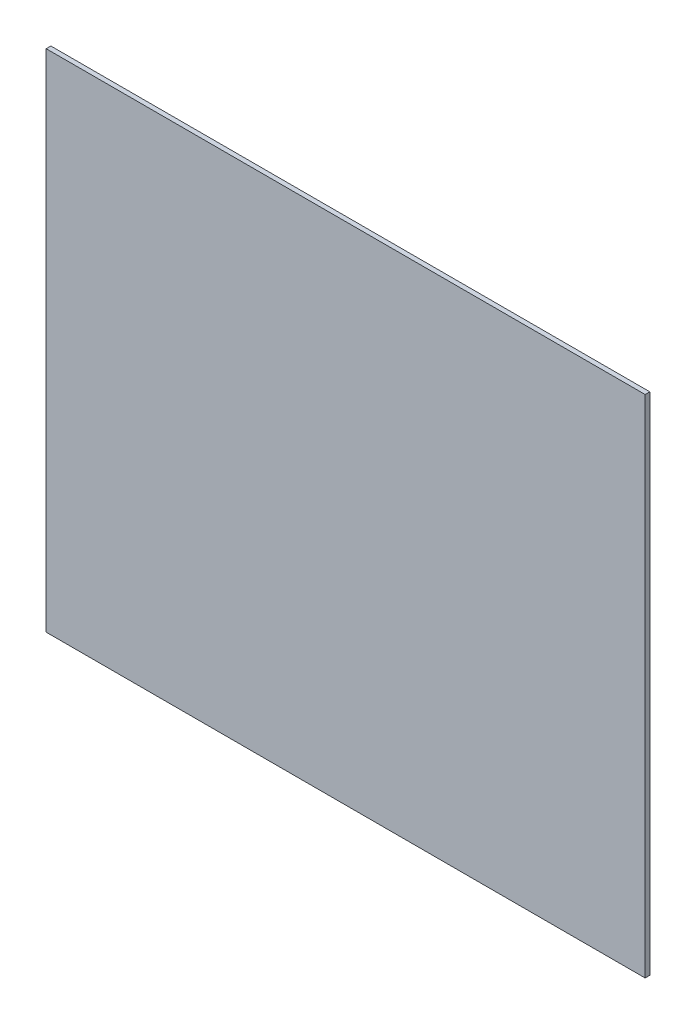
ISO-10303-21;
HEADER;
FILE_DESCRIPTION(('STEP AP214'),'2;1');
FILE_NAME('part.step','',(''),(''),'','','');
FILE_SCHEMA(('AUTOMOTIVE_DESIGN { 1 0 10303 214 1 1 1 1 }'));
ENDSEC;
DATA;
#1=APPLICATION_CONTEXT('core data for automotive mechanical design processes');
#2=APPLICATION_PROTOCOL_DEFINITION('international standard','automotive_design',2000,#1);
#3=PRODUCT_CONTEXT('',#1,'mechanical');
#4=PRODUCT('Part','Part','',(#3));
#5=PRODUCT_RELATED_PRODUCT_CATEGORY('part','',(#4));
#6=PRODUCT_DEFINITION_FORMATION('','',#4);
#7=PRODUCT_DEFINITION_CONTEXT('part definition',#1,'design');
#8=PRODUCT_DEFINITION('design','',#6,#7);
#9=PRODUCT_DEFINITION_SHAPE('','',#8);
#10=(LENGTH_UNIT() NAMED_UNIT(*) SI_UNIT(.MILLI.,.METRE.));
#11=(NAMED_UNIT(*) PLANE_ANGLE_UNIT() SI_UNIT($,.RADIAN.));
#12=(NAMED_UNIT(*) SI_UNIT($,.STERADIAN.) SOLID_ANGLE_UNIT());
#13=UNCERTAINTY_MEASURE_WITH_UNIT(LENGTH_MEASURE(1.E-05),#10,'distance_accuracy_value','');
#14=(GEOMETRIC_REPRESENTATION_CONTEXT(3) GLOBAL_UNCERTAINTY_ASSIGNED_CONTEXT((#13)) GLOBAL_UNIT_ASSIGNED_CONTEXT((#10,
#11,#12)) REPRESENTATION_CONTEXT('',''));
#15=CARTESIAN_POINT('',(0.,0.,0.));
#16=DIRECTION('',(0.,0.,1.));
#17=DIRECTION('',(1.,0.,0.));
#18=AXIS2_PLACEMENT_3D('',#15,#16,#17);
#19=CARTESIAN_POINT('',(416.,-351.,6.5));
#20=DIRECTION('',(-1.,0.,0.));
#21=DIRECTION('',(0.,0.,1.));
#22=AXIS2_PLACEMENT_3D('',#19,#20,#21);
#23=PLANE('',#22);
#24=DIRECTION('',(0.,1.,0.));
#25=VECTOR('',#24,1.);
#26=CARTESIAN_POINT('',(416.,-351.,0.));
#27=LINE('',#26,#25);
#28=CARTESIAN_POINT('',(416.,-351.,0.));
#29=VERTEX_POINT('',#28);
#30=CARTESIAN_POINT('',(416.,351.,0.));
#31=VERTEX_POINT('',#30);
#32=EDGE_CURVE('E95',#29,#31,#27,.T.);
#33=ORIENTED_EDGE('',*,*,#32,.T.);
#34=DIRECTION('',(0.,0.,-1.));
#35=VECTOR('',#34,1.);
#36=CARTESIAN_POINT('',(416.,351.,6.5));
#37=LINE('',#36,#35);
#38=CARTESIAN_POINT('',(416.,351.,6.5));
#39=VERTEX_POINT('',#38);
#40=EDGE_CURVE('E11',#39,#31,#37,.T.);
#41=ORIENTED_EDGE('',*,*,#40,.F.);
#42=DIRECTION('',(0.,1.,0.));
#43=VECTOR('',#42,1.);
#44=CARTESIAN_POINT('',(416.,-351.,6.5));
#45=LINE('',#44,#43);
#46=CARTESIAN_POINT('',(416.,-351.,6.5));
#47=VERTEX_POINT('',#46);
#48=EDGE_CURVE('E83',#47,#39,#45,.T.);
#49=ORIENTED_EDGE('',*,*,#48,.F.);
#50=DIRECTION('',(0.,0.,-1.));
#51=VECTOR('',#50,1.);
#52=CARTESIAN_POINT('',(416.,-351.,6.5));
#53=LINE('',#52,#51);
#54=EDGE_CURVE('E91',#47,#29,#53,.T.);
#55=ORIENTED_EDGE('',*,*,#54,.T.);
#56=EDGE_LOOP('',(#33,#41,#49,#55));
#57=FACE_BOUND('',#56,.T.);
#58=ADVANCED_FACE('F32',(#57),#23,.F.);
#59=CARTESIAN_POINT('',(-416.,351.,6.5));
#60=DIRECTION('',(0.,-1.,0.));
#61=DIRECTION('',(0.,0.,-1.));
#62=AXIS2_PLACEMENT_3D('',#59,#60,#61);
#63=PLANE('',#62);
#64=DIRECTION('',(-1.,0.,0.));
#65=VECTOR('',#64,1.);
#66=CARTESIAN_POINT('',(-416.,351.,0.));
#67=LINE('',#66,#65);
#68=CARTESIAN_POINT('',(-416.,351.,0.));
#69=VERTEX_POINT('',#68);
#70=EDGE_CURVE('E87',#31,#69,#67,.T.);
#71=ORIENTED_EDGE('',*,*,#70,.T.);
#72=DIRECTION('',(0.,0.,-1.));
#73=VECTOR('',#72,1.);
#74=CARTESIAN_POINT('',(-416.,351.,6.5));
#75=LINE('',#74,#73);
#76=CARTESIAN_POINT('',(-416.,351.,6.5));
#77=VERTEX_POINT('',#76);
#78=EDGE_CURVE('E40',#77,#69,#75,.T.);
#79=ORIENTED_EDGE('',*,*,#78,.F.);
#80=DIRECTION('',(-1.,0.,0.));
#81=VECTOR('',#80,1.);
#82=CARTESIAN_POINT('',(-416.,351.,6.5));
#83=LINE('',#82,#81);
#84=EDGE_CURVE('E78',#39,#77,#83,.T.);
#85=ORIENTED_EDGE('',*,*,#84,.F.);
#86=ORIENTED_EDGE('',*,*,#40,.T.);
#87=EDGE_LOOP('',(#71,#79,#85,#86));
#88=FACE_BOUND('',#87,.T.);
#89=ADVANCED_FACE('F86',(#88),#63,.F.);
#90=CARTESIAN_POINT('',(-416.,-351.,6.5));
#91=DIRECTION('',(1.,0.,0.));
#92=DIRECTION('',(0.,0.,-1.));
#93=AXIS2_PLACEMENT_3D('',#90,#91,#92);
#94=PLANE('',#93);
#95=DIRECTION('',(0.,-1.,0.));
#96=VECTOR('',#95,1.);
#97=CARTESIAN_POINT('',(-416.,-351.,0.));
#98=LINE('',#97,#96);
#99=CARTESIAN_POINT('',(-416.,-351.,0.));
#100=VERTEX_POINT('',#99);
#101=EDGE_CURVE('E65',#69,#100,#98,.T.);
#102=ORIENTED_EDGE('',*,*,#101,.T.);
#103=DIRECTION('',(0.,0.,-1.));
#104=VECTOR('',#103,1.);
#105=CARTESIAN_POINT('',(-416.,-351.,6.5));
#106=LINE('',#105,#104);
#107=CARTESIAN_POINT('',(-416.,-351.,6.5));
#108=VERTEX_POINT('',#107);
#109=EDGE_CURVE('E88',#108,#100,#106,.T.);
#110=ORIENTED_EDGE('',*,*,#109,.F.);
#111=DIRECTION('',(0.,-1.,0.));
#112=VECTOR('',#111,1.);
#113=CARTESIAN_POINT('',(-416.,-351.,6.5));
#114=LINE('',#113,#112);
#115=EDGE_CURVE('E81',#77,#108,#114,.T.);
#116=ORIENTED_EDGE('',*,*,#115,.F.);
#117=ORIENTED_EDGE('',*,*,#78,.T.);
#118=EDGE_LOOP('',(#102,#110,#116,#117));
#119=FACE_BOUND('',#118,.T.);
#120=ADVANCED_FACE('F89',(#119),#94,.F.);
#121=CARTESIAN_POINT('',(-416.,-351.,6.5));
#122=DIRECTION('',(0.,1.,0.));
#123=DIRECTION('',(0.,0.,1.));
#124=AXIS2_PLACEMENT_3D('',#121,#122,#123);
#125=PLANE('',#124);
#126=DIRECTION('',(1.,0.,0.));
#127=VECTOR('',#126,1.);
#128=CARTESIAN_POINT('',(-416.,-351.,0.));
#129=LINE('',#128,#127);
#130=EDGE_CURVE('E71',#100,#29,#129,.T.);
#131=ORIENTED_EDGE('',*,*,#130,.T.);
#132=ORIENTED_EDGE('',*,*,#54,.F.);
#133=DIRECTION('',(1.,0.,0.));
#134=VECTOR('',#133,1.);
#135=CARTESIAN_POINT('',(-416.,-351.,6.5));
#136=LINE('',#135,#134);
#137=EDGE_CURVE('E48',#108,#47,#136,.T.);
#138=ORIENTED_EDGE('',*,*,#137,.F.);
#139=ORIENTED_EDGE('',*,*,#109,.T.);
#140=EDGE_LOOP('',(#131,#132,#138,#139));
#141=FACE_BOUND('',#140,.T.);
#142=ADVANCED_FACE('F102',(#141),#125,.F.);
#143=CARTESIAN_POINT('',(0.,0.,6.5));
#144=DIRECTION('',(0.,0.,-1.));
#145=DIRECTION('',(-1.,0.,0.));
#146=AXIS2_PLACEMENT_3D('',#143,#144,#145);
#147=PLANE('',#146);
#148=ORIENTED_EDGE('',*,*,#48,.T.);
#149=ORIENTED_EDGE('',*,*,#84,.T.);
#150=ORIENTED_EDGE('',*,*,#115,.T.);
#151=ORIENTED_EDGE('',*,*,#137,.T.);
#152=EDGE_LOOP('',(#148,#149,#150,#151));
#153=FACE_BOUND('',#152,.T.);
#154=ADVANCED_FACE('F79',(#153),#147,.F.);
#155=CARTESIAN_POINT('',(0.,0.,0.));
#156=DIRECTION('',(0.,0.,-1.));
#157=DIRECTION('',(-1.,0.,0.));
#158=AXIS2_PLACEMENT_3D('',#155,#156,#157);
#159=PLANE('',#158);
#160=ORIENTED_EDGE('',*,*,#32,.F.);
#161=ORIENTED_EDGE('',*,*,#130,.F.);
#162=ORIENTED_EDGE('',*,*,#101,.F.);
#163=ORIENTED_EDGE('',*,*,#70,.F.);
#164=EDGE_LOOP('',(#160,#161,#162,#163));
#165=FACE_BOUND('',#164,.T.);
#166=ADVANCED_FACE('F105',(#165),#159,.T.);
#167=CLOSED_SHELL('',(#58,#89,#120,#142,#154,#166));
#168=MANIFOLD_SOLID_BREP('B2',#167);
#169=ADVANCED_BREP_SHAPE_REPRESENTATION('',(#18,#168),#14);
#170=SHAPE_DEFINITION_REPRESENTATION(#9,#169);
ENDSEC;
END-ISO-10303-21;
